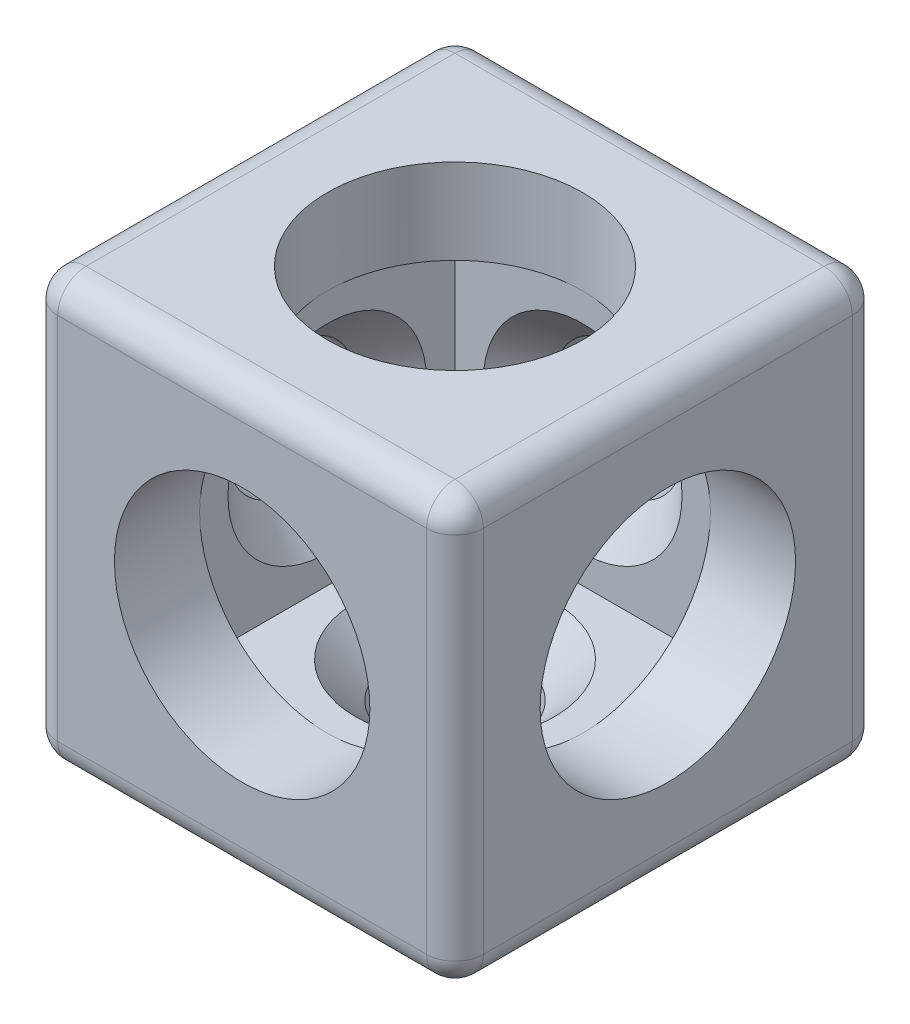
ISO-10303-21;
HEADER;
FILE_DESCRIPTION(('STEP AP214'),'2;1');
FILE_NAME('part.step','',(''),(''),'','','');
FILE_SCHEMA(('AUTOMOTIVE_DESIGN { 1 0 10303 214 1 1 1 1 }'));
ENDSEC;
DATA;
#1=APPLICATION_CONTEXT('core data for automotive mechanical design processes');
#2=APPLICATION_PROTOCOL_DEFINITION('international standard','automotive_design',2000,#1);
#3=PRODUCT_CONTEXT('',#1,'mechanical');
#4=PRODUCT('Part','Part','',(#3));
#5=PRODUCT_RELATED_PRODUCT_CATEGORY('part','',(#4));
#6=PRODUCT_DEFINITION_FORMATION('','',#4);
#7=PRODUCT_DEFINITION_CONTEXT('part definition',#1,'design');
#8=PRODUCT_DEFINITION('design','',#6,#7);
#9=PRODUCT_DEFINITION_SHAPE('','',#8);
#10=(LENGTH_UNIT() NAMED_UNIT(*) SI_UNIT(.MILLI.,.METRE.));
#11=(NAMED_UNIT(*) PLANE_ANGLE_UNIT() SI_UNIT($,.RADIAN.));
#12=(NAMED_UNIT(*) SI_UNIT($,.STERADIAN.) SOLID_ANGLE_UNIT());
#13=UNCERTAINTY_MEASURE_WITH_UNIT(LENGTH_MEASURE(1.E-05),#10,'distance_accuracy_value','');
#14=(GEOMETRIC_REPRESENTATION_CONTEXT(3) GLOBAL_UNCERTAINTY_ASSIGNED_CONTEXT((#13)) GLOBAL_UNIT_ASSIGNED_CONTEXT((#10,
#11,#12)) REPRESENTATION_CONTEXT('',''));
#15=CARTESIAN_POINT('',(0.,0.,0.));
#16=DIRECTION('',(0.,0.,1.));
#17=DIRECTION('',(1.,0.,0.));
#18=AXIS2_PLACEMENT_3D('',#15,#16,#17);
#19=CARTESIAN_POINT('',(2.00000000000001,24.,30.));
#20=DIRECTION('',(0.,-1.,0.));
#21=DIRECTION('',(0.,0.,-1.));
#22=AXIS2_PLACEMENT_3D('',#19,#20,#21);
#23=PLANE('',#22);
#24=CARTESIAN_POINT('',(15.,24.,15.));
#25=DIRECTION('',(0.,-1.,0.));
#26=DIRECTION('',(0.,0.,-1.));
#27=AXIS2_PLACEMENT_3D('',#24,#25,#26);
#28=CIRCLE('',#27,9.00000000000001);
#29=CARTESIAN_POINT('',(15.,24.,6.));
#30=VERTEX_POINT('',#29);
#31=CARTESIAN_POINT('',(24.,24.,15.));
#32=VERTEX_POINT('',#31);
#33=EDGE_CURVE('E172',#30,#32,#28,.T.);
#34=ORIENTED_EDGE('',*,*,#33,.F.);
#35=DIRECTION('',(-1.,0.,0.));
#36=VECTOR('',#35,1.);
#37=CARTESIAN_POINT('',(2.00000000000001,24.,6.));
#38=LINE('',#37,#36);
#39=CARTESIAN_POINT('',(24.,24.,6.));
#40=VERTEX_POINT('',#39);
#41=EDGE_CURVE('E213',#40,#30,#38,.T.);
#42=ORIENTED_EDGE('',*,*,#41,.F.);
#43=DIRECTION('',(0.,0.,-1.));
#44=VECTOR('',#43,1.);
#45=CARTESIAN_POINT('',(24.,24.,30.));
#46=LINE('',#45,#44);
#47=EDGE_CURVE('E208',#32,#40,#46,.T.);
#48=ORIENTED_EDGE('',*,*,#47,.F.);
#49=EDGE_LOOP('',(#34,#42,#48));
#50=FACE_BOUND('',#49,.T.);
#51=ADVANCED_FACE('F34',(#50),#23,.T.);
#52=CARTESIAN_POINT('',(15.,24.,24.));
#53=VERTEX_POINT('',#52);
#54=EDGE_CURVE('E176',#32,#53,#28,.T.);
#55=ORIENTED_EDGE('',*,*,#54,.F.);
#56=CARTESIAN_POINT('',(24.,24.,24.));
#57=VERTEX_POINT('',#56);
#58=EDGE_CURVE('E190',#57,#32,#46,.T.);
#59=ORIENTED_EDGE('',*,*,#58,.F.);
#60=DIRECTION('',(1.,0.,0.));
#61=VECTOR('',#60,1.);
#62=CARTESIAN_POINT('',(2.,24.,24.));
#63=LINE('',#62,#61);
#64=EDGE_CURVE('E191',#53,#57,#63,.T.);
#65=ORIENTED_EDGE('',*,*,#64,.F.);
#66=EDGE_LOOP('',(#55,#59,#65));
#67=FACE_BOUND('',#66,.T.);
#68=ADVANCED_FACE('F188',(#67),#23,.T.);
#69=CARTESIAN_POINT('',(6.,24.,15.));
#70=VERTEX_POINT('',#69);
#71=EDGE_CURVE('E49',#53,#70,#28,.T.);
#72=ORIENTED_EDGE('',*,*,#71,.F.);
#73=CARTESIAN_POINT('',(6.,24.,24.));
#74=VERTEX_POINT('',#73);
#75=EDGE_CURVE('E296',#74,#53,#63,.T.);
#76=ORIENTED_EDGE('',*,*,#75,.F.);
#77=DIRECTION('',(0.,0.,-1.));
#78=VECTOR('',#77,1.);
#79=CARTESIAN_POINT('',(6.,24.,30.));
#80=LINE('',#79,#78);
#81=EDGE_CURVE('E298',#74,#70,#80,.T.);
#82=ORIENTED_EDGE('',*,*,#81,.T.);
#83=EDGE_LOOP('',(#72,#76,#82));
#84=FACE_BOUND('',#83,.T.);
#85=ADVANCED_FACE('F272',(#84),#23,.T.);
#86=CARTESIAN_POINT('',(24.,2.00000000000001,30.));
#87=DIRECTION('',(-1.,0.,0.));
#88=DIRECTION('',(0.,0.,1.));
#89=AXIS2_PLACEMENT_3D('',#86,#87,#88);
#90=PLANE('',#89);
#91=CARTESIAN_POINT('',(24.,15.,15.));
#92=DIRECTION('',(-1.,0.,0.));
#93=DIRECTION('',(0.,0.,1.));
#94=AXIS2_PLACEMENT_3D('',#91,#92,#93);
#95=CIRCLE('',#94,9.);
#96=CARTESIAN_POINT('',(24.,15.,24.));
#97=VERTEX_POINT('',#96);
#98=EDGE_CURVE('E194',#97,#32,#95,.T.);
#99=ORIENTED_EDGE('',*,*,#98,.F.);
#100=DIRECTION('',(0.,-1.,0.));
#101=VECTOR('',#100,1.);
#102=CARTESIAN_POINT('',(24.,2.,24.));
#103=LINE('',#102,#101);
#104=EDGE_CURVE('E214',#57,#97,#103,.T.);
#105=ORIENTED_EDGE('',*,*,#104,.F.);
#106=ORIENTED_EDGE('',*,*,#58,.T.);
#107=EDGE_LOOP('',(#99,#105,#106));
#108=FACE_BOUND('',#107,.T.);
#109=ADVANCED_FACE('F216',(#108),#90,.T.);
#110=CARTESIAN_POINT('',(24.,15.,6.));
#111=VERTEX_POINT('',#110);
#112=EDGE_CURVE('E198',#32,#111,#95,.T.);
#113=ORIENTED_EDGE('',*,*,#112,.F.);
#114=ORIENTED_EDGE('',*,*,#47,.T.);
#115=DIRECTION('',(0.,1.,0.));
#116=VECTOR('',#115,1.);
#117=CARTESIAN_POINT('',(24.,2.00000000000001,6.));
#118=LINE('',#117,#116);
#119=EDGE_CURVE('E210',#111,#40,#118,.T.);
#120=ORIENTED_EDGE('',*,*,#119,.F.);
#121=EDGE_LOOP('',(#113,#114,#120));
#122=FACE_BOUND('',#121,.T.);
#123=ADVANCED_FACE('F207',(#122),#90,.T.);
#124=CARTESIAN_POINT('',(24.,6.,15.));
#125=VERTEX_POINT('',#124);
#126=EDGE_CURVE('E57',#111,#125,#95,.T.);
#127=ORIENTED_EDGE('',*,*,#126,.F.);
#128=CARTESIAN_POINT('',(24.,6.,6.));
#129=VERTEX_POINT('',#128);
#130=EDGE_CURVE('E225',#129,#111,#118,.T.);
#131=ORIENTED_EDGE('',*,*,#130,.F.);
#132=DIRECTION('',(0.,0.,-1.));
#133=VECTOR('',#132,1.);
#134=CARTESIAN_POINT('',(24.,6.,30.));
#135=LINE('',#134,#133);
#136=EDGE_CURVE('E230',#125,#129,#135,.T.);
#137=ORIENTED_EDGE('',*,*,#136,.F.);
#138=EDGE_LOOP('',(#127,#131,#137));
#139=FACE_BOUND('',#138,.T.);
#140=ADVANCED_FACE('F287',(#139),#90,.T.);
#141=CARTESIAN_POINT('',(2.,2.,24.));
#142=DIRECTION('',(0.,0.,1.));
#143=DIRECTION('',(1.,0.,0.));
#144=AXIS2_PLACEMENT_3D('',#141,#142,#143);
#145=PLANE('',#144);
#146=ORIENTED_EDGE('',*,*,#104,.T.);
#147=CARTESIAN_POINT('',(15.,15.,24.));
#148=DIRECTION('',(0.,0.,1.));
#149=DIRECTION('',(1.,0.,0.));
#150=AXIS2_PLACEMENT_3D('',#147,#148,#149);
#151=CIRCLE('',#150,9.);
#152=EDGE_CURVE('E239',#97,#53,#151,.T.);
#153=ORIENTED_EDGE('',*,*,#152,.T.);
#154=ORIENTED_EDGE('',*,*,#64,.T.);
#155=EDGE_LOOP('',(#146,#153,#154));
#156=FACE_BOUND('',#155,.T.);
#157=ADVANCED_FACE('F308',(#156),#145,.F.);
#158=ORIENTED_EDGE('',*,*,#75,.T.);
#159=CARTESIAN_POINT('',(6.,15.,24.));
#160=VERTEX_POINT('',#159);
#161=EDGE_CURVE('E301',#53,#160,#151,.T.);
#162=ORIENTED_EDGE('',*,*,#161,.T.);
#163=DIRECTION('',(0.,1.,0.));
#164=VECTOR('',#163,1.);
#165=CARTESIAN_POINT('',(6.,2.,24.));
#166=LINE('',#165,#164);
#167=EDGE_CURVE('E312',#160,#74,#166,.T.);
#168=ORIENTED_EDGE('',*,*,#167,.T.);
#169=EDGE_LOOP('',(#158,#162,#168));
#170=FACE_BOUND('',#169,.T.);
#171=ADVANCED_FACE('F583',(#170),#145,.F.);
#172=CARTESIAN_POINT('',(6.,6.,24.));
#173=VERTEX_POINT('',#172);
#174=EDGE_CURVE('E313',#173,#160,#166,.T.);
#175=ORIENTED_EDGE('',*,*,#174,.T.);
#176=CARTESIAN_POINT('',(15.,6.,24.));
#177=VERTEX_POINT('',#176);
#178=EDGE_CURVE('E237',#160,#177,#151,.T.);
#179=ORIENTED_EDGE('',*,*,#178,.T.);
#180=DIRECTION('',(1.,0.,0.));
#181=VECTOR('',#180,1.);
#182=CARTESIAN_POINT('',(2.00000000000001,6.,24.));
#183=LINE('',#182,#181);
#184=EDGE_CURVE('E317',#173,#177,#183,.T.);
#185=ORIENTED_EDGE('',*,*,#184,.F.);
#186=EDGE_LOOP('',(#175,#179,#185));
#187=FACE_BOUND('',#186,.T.);
#188=ADVANCED_FACE('F578',(#187),#145,.F.);
#189=CARTESIAN_POINT('',(2.00000000000001,6.,30.));
#190=DIRECTION('',(0.,1.,0.));
#191=DIRECTION('',(0.,0.,1.));
#192=AXIS2_PLACEMENT_3D('',#189,#190,#191);
#193=PLANE('',#192);
#194=CARTESIAN_POINT('',(15.,6.,15.));
#195=DIRECTION('',(0.,1.,0.));
#196=DIRECTION('',(0.,0.,1.));
#197=AXIS2_PLACEMENT_3D('',#194,#195,#196);
#198=CIRCLE('',#197,7.00000000000001);
#199=CARTESIAN_POINT('',(15.,6.,22.));
#200=VERTEX_POINT('',#199);
#201=EDGE_CURVE('E243',#200,#200,#198,.F.);
#202=ORIENTED_EDGE('',*,*,#201,.T.);
#203=EDGE_LOOP('',(#202));
#204=FACE_BOUND('',#203,.T.);
#205=CARTESIAN_POINT('',(24.,6.,24.));
#206=VERTEX_POINT('',#205);
#207=EDGE_CURVE('E227',#206,#125,#135,.T.);
#208=ORIENTED_EDGE('',*,*,#207,.T.);
#209=ORIENTED_EDGE('',*,*,#136,.T.);
#210=DIRECTION('',(-1.,0.,0.));
#211=VECTOR('',#210,1.);
#212=CARTESIAN_POINT('',(2.,6.,6.));
#213=LINE('',#212,#211);
#214=CARTESIAN_POINT('',(6.,6.,6.));
#215=VERTEX_POINT('',#214);
#216=EDGE_CURVE('E320',#129,#215,#213,.T.);
#217=ORIENTED_EDGE('',*,*,#216,.T.);
#218=DIRECTION('',(0.,0.,-1.));
#219=VECTOR('',#218,1.);
#220=CARTESIAN_POINT('',(6.,6.,30.));
#221=LINE('',#220,#219);
#222=EDGE_CURVE('E231',#173,#215,#221,.T.);
#223=ORIENTED_EDGE('',*,*,#222,.F.);
#224=ORIENTED_EDGE('',*,*,#184,.T.);
#225=EDGE_CURVE('E316',#177,#206,#183,.T.);
#226=ORIENTED_EDGE('',*,*,#225,.T.);
#227=EDGE_LOOP('',(#208,#209,#217,#223,#224,#226));
#228=FACE_BOUND('',#227,.T.);
#229=ADVANCED_FACE('F285',(#204,#228),#193,.T.);
#230=EDGE_CURVE('E199',#125,#97,#95,.T.);
#231=ORIENTED_EDGE('',*,*,#230,.F.);
#232=ORIENTED_EDGE('',*,*,#207,.F.);
#233=EDGE_CURVE('E224',#97,#206,#103,.T.);
#234=ORIENTED_EDGE('',*,*,#233,.F.);
#235=EDGE_LOOP('',(#231,#232,#234));
#236=FACE_BOUND('',#235,.T.);
#237=ADVANCED_FACE('F277',(#236),#90,.T.);
#238=EDGE_CURVE('E177',#70,#30,#28,.T.);
#239=ORIENTED_EDGE('',*,*,#238,.F.);
#240=CARTESIAN_POINT('',(6.,24.,6.));
#241=VERTEX_POINT('',#240);
#242=EDGE_CURVE('E309',#70,#241,#80,.T.);
#243=ORIENTED_EDGE('',*,*,#242,.T.);
#244=EDGE_CURVE('E218',#30,#241,#38,.T.);
#245=ORIENTED_EDGE('',*,*,#244,.F.);
#246=EDGE_LOOP('',(#239,#243,#245));
#247=FACE_BOUND('',#246,.T.);
#248=ADVANCED_FACE('F268',(#247),#23,.T.);
#249=CARTESIAN_POINT('',(6.,2.00000000000001,30.));
#250=DIRECTION('',(1.,0.,0.));
#251=DIRECTION('',(0.,0.,-1.));
#252=AXIS2_PLACEMENT_3D('',#249,#250,#251);
#253=PLANE('',#252);
#254=CARTESIAN_POINT('',(6.,15.,15.));
#255=DIRECTION('',(1.,0.,0.));
#256=DIRECTION('',(0.,0.,-1.));
#257=AXIS2_PLACEMENT_3D('',#254,#255,#256);
#258=CIRCLE('',#257,7.00000000000001);
#259=CARTESIAN_POINT('',(6.,15.,7.99999999999999));
#260=VERTEX_POINT('',#259);
#261=EDGE_CURVE('E11',#260,#260,#258,.F.);
#262=ORIENTED_EDGE('',*,*,#261,.T.);
#263=EDGE_LOOP('',(#262));
#264=FACE_BOUND('',#263,.T.);
#265=ORIENTED_EDGE('',*,*,#242,.F.);
#266=ORIENTED_EDGE('',*,*,#81,.F.);
#267=ORIENTED_EDGE('',*,*,#167,.F.);
#268=ORIENTED_EDGE('',*,*,#174,.F.);
#269=ORIENTED_EDGE('',*,*,#222,.T.);
#270=DIRECTION('',(0.,1.,0.));
#271=VECTOR('',#270,1.);
#272=CARTESIAN_POINT('',(6.,2.,6.));
#273=LINE('',#272,#271);
#274=EDGE_CURVE('E238',#215,#241,#273,.T.);
#275=ORIENTED_EDGE('',*,*,#274,.T.);
#276=EDGE_LOOP('',(#265,#266,#267,#268,#269,#275));
#277=FACE_BOUND('',#276,.T.);
#278=ADVANCED_FACE('F276',(#264,#277),#253,.T.);
#279=ORIENTED_EDGE('',*,*,#225,.F.);
#280=EDGE_CURVE('E234',#177,#97,#151,.T.);
#281=ORIENTED_EDGE('',*,*,#280,.T.);
#282=ORIENTED_EDGE('',*,*,#233,.T.);
#283=EDGE_LOOP('',(#279,#281,#282));
#284=FACE_BOUND('',#283,.T.);
#285=ADVANCED_FACE('F283',(#284),#145,.F.);
#286=CARTESIAN_POINT('',(2.,2.,6.));
#287=DIRECTION('',(0.,0.,1.));
#288=DIRECTION('',(1.,0.,0.));
#289=AXIS2_PLACEMENT_3D('',#286,#287,#288);
#290=PLANE('',#289);
#291=CARTESIAN_POINT('',(15.,15.,6.));
#292=DIRECTION('',(0.,0.,1.));
#293=DIRECTION('',(1.,0.,0.));
#294=AXIS2_PLACEMENT_3D('',#291,#292,#293);
#295=CIRCLE('',#294,7.00000000000001);
#296=CARTESIAN_POINT('',(22.,15.,6.));
#297=VERTEX_POINT('',#296);
#298=EDGE_CURVE('E249',#297,#297,#295,.F.);
#299=ORIENTED_EDGE('',*,*,#298,.T.);
#300=EDGE_LOOP('',(#299));
#301=FACE_BOUND('',#300,.T.);
#302=ORIENTED_EDGE('',*,*,#41,.T.);
#303=ORIENTED_EDGE('',*,*,#244,.T.);
#304=ORIENTED_EDGE('',*,*,#274,.F.);
#305=ORIENTED_EDGE('',*,*,#216,.F.);
#306=ORIENTED_EDGE('',*,*,#130,.T.);
#307=ORIENTED_EDGE('',*,*,#119,.T.);
#308=EDGE_LOOP('',(#302,#303,#304,#305,#306,#307));
#309=FACE_BOUND('',#308,.T.);
#310=ADVANCED_FACE('F598',(#301,#309),#290,.T.);
#311=CARTESIAN_POINT('',(15.,15.,20.));
#312=DIRECTION('',(0.,0.,1.));
#313=DIRECTION('',(1.,0.,0.));
#314=AXIS2_PLACEMENT_3D('',#311,#312,#313);
#315=CYLINDRICAL_SURFACE('',#314,9.);
#316=CARTESIAN_POINT('',(15.,15.,30.));
#317=DIRECTION('',(0.,0.,1.));
#318=DIRECTION('',(1.,0.,0.));
#319=AXIS2_PLACEMENT_3D('',#316,#317,#318);
#320=CIRCLE('',#319,9.);
#321=CARTESIAN_POINT('',(24.,15.,30.));
#322=VERTEX_POINT('',#321);
#323=EDGE_CURVE('E203',#322,#322,#320,.T.);
#324=ORIENTED_EDGE('',*,*,#323,.T.);
#325=EDGE_LOOP('',(#324));
#326=FACE_BOUND('',#325,.T.);
#327=ORIENTED_EDGE('',*,*,#280,.F.);
#328=ORIENTED_EDGE('',*,*,#178,.F.);
#329=ORIENTED_EDGE('',*,*,#161,.F.);
#330=ORIENTED_EDGE('',*,*,#152,.F.);
#331=EDGE_LOOP('',(#327,#328,#329,#330));
#332=FACE_BOUND('',#331,.T.);
#333=ADVANCED_FACE('F303',(#326,#332),#315,.F.);
#334=CARTESIAN_POINT('',(2.,2.,30.));
#335=DIRECTION('',(0.,0.,-1.));
#336=DIRECTION('',(-1.,0.,0.));
#337=AXIS2_PLACEMENT_3D('',#334,#335,#336);
#338=CYLINDRICAL_SURFACE('',#337,2.);
#339=DIRECTION('',(0.,0.,-1.));
#340=VECTOR('',#339,1.);
#341=CARTESIAN_POINT('',(0.,2.00000000000001,30.));
#342=LINE('',#341,#340);
#343=CARTESIAN_POINT('',(0.,2.00000000000001,28.));
#344=VERTEX_POINT('',#343);
#345=CARTESIAN_POINT('',(0.,2.00000000000001,2.));
#346=VERTEX_POINT('',#345);
#347=EDGE_CURVE('E351',#344,#346,#342,.T.);
#348=ORIENTED_EDGE('',*,*,#347,.T.);
#349=CARTESIAN_POINT('',(2.,2.,2.));
#350=DIRECTION('',(0.,0.,-1.));
#351=DIRECTION('',(-1.,0.,0.));
#352=AXIS2_PLACEMENT_3D('',#349,#350,#351);
#353=CIRCLE('',#352,2.);
#354=CARTESIAN_POINT('',(2.00000000000001,0.,2.));
#355=VERTEX_POINT('',#354);
#356=EDGE_CURVE('E378',#346,#355,#353,.F.);
#357=ORIENTED_EDGE('',*,*,#356,.T.);
#358=DIRECTION('',(0.,0.,-1.));
#359=VECTOR('',#358,1.);
#360=CARTESIAN_POINT('',(2.00000000000001,0.,30.));
#361=LINE('',#360,#359);
#362=CARTESIAN_POINT('',(2.00000000000001,0.,28.));
#363=VERTEX_POINT('',#362);
#364=EDGE_CURVE('E421',#363,#355,#361,.T.);
#365=ORIENTED_EDGE('',*,*,#364,.F.);
#366=CARTESIAN_POINT('',(2.,2.,28.));
#367=DIRECTION('',(0.,0.,-1.));
#368=DIRECTION('',(-1.,0.,0.));
#369=AXIS2_PLACEMENT_3D('',#366,#367,#368);
#370=CIRCLE('',#369,2.);
#371=EDGE_CURVE('E380',#363,#344,#370,.T.);
#372=ORIENTED_EDGE('',*,*,#371,.T.);
#373=EDGE_LOOP('',(#348,#357,#365,#372));
#374=FACE_BOUND('',#373,.T.);
#375=ADVANCED_FACE('F467',(#374),#338,.T.);
#376=CARTESIAN_POINT('',(2.00000000000001,0.,30.));
#377=DIRECTION('',(0.,1.,0.));
#378=DIRECTION('',(0.,0.,1.));
#379=AXIS2_PLACEMENT_3D('',#376,#377,#378);
#380=PLANE('',#379);
#381=CARTESIAN_POINT('',(15.,0.,15.));
#382=DIRECTION('',(0.,-1.,0.));
#383=DIRECTION('',(0.,0.,-1.));
#384=AXIS2_PLACEMENT_3D('',#381,#382,#383);
#385=CIRCLE('',#384,4.5);
#386=CARTESIAN_POINT('',(15.,0.,10.5));
#387=VERTEX_POINT('',#386);
#388=EDGE_CURVE('E457',#387,#387,#385,.T.);
#389=ORIENTED_EDGE('',*,*,#388,.F.);
#390=EDGE_LOOP('',(#389));
#391=FACE_BOUND('',#390,.T.);
#392=ORIENTED_EDGE('',*,*,#364,.T.);
#393=DIRECTION('',(1.,0.,0.));
#394=VECTOR('',#393,1.);
#395=CARTESIAN_POINT('',(2.00000000000001,0.,2.));
#396=LINE('',#395,#394);
#397=CARTESIAN_POINT('',(28.,0.,2.));
#398=VERTEX_POINT('',#397);
#399=EDGE_CURVE('E416',#355,#398,#396,.T.);
#400=ORIENTED_EDGE('',*,*,#399,.T.);
#401=DIRECTION('',(0.,0.,-1.));
#402=VECTOR('',#401,1.);
#403=CARTESIAN_POINT('',(28.,0.,30.));
#404=LINE('',#403,#402);
#405=CARTESIAN_POINT('',(28.,0.,28.));
#406=VERTEX_POINT('',#405);
#407=EDGE_CURVE('E424',#406,#398,#404,.T.);
#408=ORIENTED_EDGE('',*,*,#407,.F.);
#409=DIRECTION('',(1.,0.,0.));
#410=VECTOR('',#409,1.);
#411=CARTESIAN_POINT('',(2.00000000000001,0.,28.));
#412=LINE('',#411,#410);
#413=EDGE_CURVE('E419',#406,#363,#412,.F.);
#414=ORIENTED_EDGE('',*,*,#413,.T.);
#415=EDGE_LOOP('',(#392,#400,#408,#414));
#416=FACE_BOUND('',#415,.T.);
#417=ADVANCED_FACE('F463',(#391,#416),#380,.F.);
#418=CARTESIAN_POINT('',(28.,2.,30.));
#419=DIRECTION('',(0.,0.,-1.));
#420=DIRECTION('',(-1.,0.,0.));
#421=AXIS2_PLACEMENT_3D('',#418,#419,#420);
#422=CYLINDRICAL_SURFACE('',#421,2.);
#423=ORIENTED_EDGE('',*,*,#407,.T.);
#424=CARTESIAN_POINT('',(28.,2.,2.));
#425=DIRECTION('',(0.,0.,-1.));
#426=DIRECTION('',(-1.,0.,0.));
#427=AXIS2_PLACEMENT_3D('',#424,#425,#426);
#428=CIRCLE('',#427,2.);
#429=CARTESIAN_POINT('',(30.,2.00000000000001,2.));
#430=VERTEX_POINT('',#429);
#431=EDGE_CURVE('E403',#398,#430,#428,.F.);
#432=ORIENTED_EDGE('',*,*,#431,.T.);
#433=DIRECTION('',(0.,0.,-1.));
#434=VECTOR('',#433,1.);
#435=CARTESIAN_POINT('',(30.,2.00000000000001,30.));
#436=LINE('',#435,#434);
#437=CARTESIAN_POINT('',(30.,2.00000000000001,28.));
#438=VERTEX_POINT('',#437);
#439=EDGE_CURVE('E427',#438,#430,#436,.T.);
#440=ORIENTED_EDGE('',*,*,#439,.F.);
#441=CARTESIAN_POINT('',(28.,2.,28.));
#442=DIRECTION('',(0.,0.,-1.));
#443=DIRECTION('',(-1.,0.,0.));
#444=AXIS2_PLACEMENT_3D('',#441,#442,#443);
#445=CIRCLE('',#444,2.);
#446=EDGE_CURVE('E405',#438,#406,#445,.T.);
#447=ORIENTED_EDGE('',*,*,#446,.T.);
#448=EDGE_LOOP('',(#423,#432,#440,#447));
#449=FACE_BOUND('',#448,.T.);
#450=ADVANCED_FACE('F466',(#449),#422,.T.);
#451=CARTESIAN_POINT('',(30.,2.00000000000001,30.));
#452=DIRECTION('',(-1.,0.,0.));
#453=DIRECTION('',(0.,0.,1.));
#454=AXIS2_PLACEMENT_3D('',#451,#452,#453);
#455=PLANE('',#454);
#456=CARTESIAN_POINT('',(30.,15.,15.));
#457=DIRECTION('',(1.,0.,0.));
#458=DIRECTION('',(0.,0.,-1.));
#459=AXIS2_PLACEMENT_3D('',#456,#457,#458);
#460=CIRCLE('',#459,9.);
#461=CARTESIAN_POINT('',(30.,15.,6.));
#462=VERTEX_POINT('',#461);
#463=EDGE_CURVE('E182',#462,#462,#460,.T.);
#464=ORIENTED_EDGE('',*,*,#463,.F.);
#465=EDGE_LOOP('',(#464));
#466=FACE_BOUND('',#465,.T.);
#467=ORIENTED_EDGE('',*,*,#439,.T.);
#468=DIRECTION('',(0.,1.,0.));
#469=VECTOR('',#468,1.);
#470=CARTESIAN_POINT('',(30.,2.00000000000001,2.));
#471=LINE('',#470,#469);
#472=CARTESIAN_POINT('',(30.,28.,2.));
#473=VERTEX_POINT('',#472);
#474=EDGE_CURVE('E399',#430,#473,#471,.T.);
#475=ORIENTED_EDGE('',*,*,#474,.T.);
#476=DIRECTION('',(0.,0.,-1.));
#477=VECTOR('',#476,1.);
#478=CARTESIAN_POINT('',(30.,28.,30.));
#479=LINE('',#478,#477);
#480=CARTESIAN_POINT('',(30.,28.,28.));
#481=VERTEX_POINT('',#480);
#482=EDGE_CURVE('E430',#481,#473,#479,.T.);
#483=ORIENTED_EDGE('',*,*,#482,.F.);
#484=DIRECTION('',(0.,1.,0.));
#485=VECTOR('',#484,1.);
#486=CARTESIAN_POINT('',(30.,2.00000000000001,28.));
#487=LINE('',#486,#485);
#488=EDGE_CURVE('E401',#481,#438,#487,.F.);
#489=ORIENTED_EDGE('',*,*,#488,.T.);
#490=EDGE_LOOP('',(#467,#475,#483,#489));
#491=FACE_BOUND('',#490,.T.);
#492=ADVANCED_FACE('F494',(#466,#491),#455,.F.);
#493=CARTESIAN_POINT('',(28.,28.,30.));
#494=DIRECTION('',(0.,0.,-1.));
#495=DIRECTION('',(-1.,0.,0.));
#496=AXIS2_PLACEMENT_3D('',#493,#494,#495);
#497=CYLINDRICAL_SURFACE('',#496,2.);
#498=ORIENTED_EDGE('',*,*,#482,.T.);
#499=CARTESIAN_POINT('',(28.,28.,2.));
#500=DIRECTION('',(0.,0.,-1.));
#501=DIRECTION('',(-1.,0.,0.));
#502=AXIS2_PLACEMENT_3D('',#499,#500,#501);
#503=CIRCLE('',#502,2.);
#504=CARTESIAN_POINT('',(28.,30.,2.));
#505=VERTEX_POINT('',#504);
#506=EDGE_CURVE('E395',#473,#505,#503,.F.);
#507=ORIENTED_EDGE('',*,*,#506,.T.);
#508=DIRECTION('',(0.,0.,-1.));
#509=VECTOR('',#508,1.);
#510=CARTESIAN_POINT('',(28.,30.,30.));
#511=LINE('',#510,#509);
#512=CARTESIAN_POINT('',(28.,30.,28.));
#513=VERTEX_POINT('',#512);
#514=EDGE_CURVE('E433',#513,#505,#511,.T.);
#515=ORIENTED_EDGE('',*,*,#514,.F.);
#516=CARTESIAN_POINT('',(28.,28.,28.));
#517=DIRECTION('',(0.,0.,-1.));
#518=DIRECTION('',(-1.,0.,0.));
#519=AXIS2_PLACEMENT_3D('',#516,#517,#518);
#520=CIRCLE('',#519,2.);
#521=EDGE_CURVE('E397',#513,#481,#520,.T.);
#522=ORIENTED_EDGE('',*,*,#521,.T.);
#523=EDGE_LOOP('',(#498,#507,#515,#522));
#524=FACE_BOUND('',#523,.T.);
#525=ADVANCED_FACE('F507',(#524),#497,.T.);
#526=CARTESIAN_POINT('',(2.00000000000001,30.,30.));
#527=DIRECTION('',(0.,-1.,0.));
#528=DIRECTION('',(0.,0.,-1.));
#529=AXIS2_PLACEMENT_3D('',#526,#527,#528);
#530=PLANE('',#529);
#531=CARTESIAN_POINT('',(15.,30.,15.));
#532=DIRECTION('',(0.,1.,0.));
#533=DIRECTION('',(0.,0.,1.));
#534=AXIS2_PLACEMENT_3D('',#531,#532,#533);
#535=CIRCLE('',#534,9.00000000000001);
#536=CARTESIAN_POINT('',(15.,30.,24.));
#537=VERTEX_POINT('',#536);
#538=EDGE_CURVE('E448',#537,#537,#535,.T.);
#539=ORIENTED_EDGE('',*,*,#538,.F.);
#540=EDGE_LOOP('',(#539));
#541=FACE_BOUND('',#540,.T.);
#542=ORIENTED_EDGE('',*,*,#514,.T.);
#543=DIRECTION('',(-1.,0.,0.));
#544=VECTOR('',#543,1.);
#545=CARTESIAN_POINT('',(2.00000000000001,30.,2.));
#546=LINE('',#545,#544);
#547=CARTESIAN_POINT('',(2.00000000000001,30.,2.));
#548=VERTEX_POINT('',#547);
#549=EDGE_CURVE('E391',#505,#548,#546,.T.);
#550=ORIENTED_EDGE('',*,*,#549,.T.);
#551=DIRECTION('',(0.,0.,-1.));
#552=VECTOR('',#551,1.);
#553=CARTESIAN_POINT('',(2.00000000000001,30.,30.));
#554=LINE('',#553,#552);
#555=CARTESIAN_POINT('',(2.00000000000001,30.,28.));
#556=VERTEX_POINT('',#555);
#557=EDGE_CURVE('E436',#556,#548,#554,.T.);
#558=ORIENTED_EDGE('',*,*,#557,.F.);
#559=DIRECTION('',(-1.,0.,0.));
#560=VECTOR('',#559,1.);
#561=CARTESIAN_POINT('',(28.,30.,28.));
#562=LINE('',#561,#560);
#563=EDGE_CURVE('E393',#556,#513,#562,.F.);
#564=ORIENTED_EDGE('',*,*,#563,.T.);
#565=EDGE_LOOP('',(#542,#550,#558,#564));
#566=FACE_BOUND('',#565,.T.);
#567=ADVANCED_FACE('F511',(#541,#566),#530,.F.);
#568=CARTESIAN_POINT('',(2.,28.,30.));
#569=DIRECTION('',(0.,0.,-1.));
#570=DIRECTION('',(-1.,0.,0.));
#571=AXIS2_PLACEMENT_3D('',#568,#569,#570);
#572=CYLINDRICAL_SURFACE('',#571,2.);
#573=ORIENTED_EDGE('',*,*,#557,.T.);
#574=CARTESIAN_POINT('',(2.,28.,2.));
#575=DIRECTION('',(0.,0.,-1.));
#576=DIRECTION('',(-1.,0.,0.));
#577=AXIS2_PLACEMENT_3D('',#574,#575,#576);
#578=CIRCLE('',#577,2.);
#579=CARTESIAN_POINT('',(0.,28.,2.));
#580=VERTEX_POINT('',#579);
#581=EDGE_CURVE('E387',#548,#580,#578,.F.);
#582=ORIENTED_EDGE('',*,*,#581,.T.);
#583=DIRECTION('',(0.,0.,-1.));
#584=VECTOR('',#583,1.);
#585=CARTESIAN_POINT('',(0.,28.,30.));
#586=LINE('',#585,#584);
#587=CARTESIAN_POINT('',(0.,28.,28.));
#588=VERTEX_POINT('',#587);
#589=EDGE_CURVE('E439',#588,#580,#586,.T.);
#590=ORIENTED_EDGE('',*,*,#589,.F.);
#591=CARTESIAN_POINT('',(2.,28.,28.));
#592=DIRECTION('',(0.,0.,-1.));
#593=DIRECTION('',(-1.,0.,0.));
#594=AXIS2_PLACEMENT_3D('',#591,#592,#593);
#595=CIRCLE('',#594,2.);
#596=EDGE_CURVE('E389',#588,#556,#595,.T.);
#597=ORIENTED_EDGE('',*,*,#596,.T.);
#598=EDGE_LOOP('',(#573,#582,#590,#597));
#599=FACE_BOUND('',#598,.T.);
#600=ADVANCED_FACE('F525',(#599),#572,.T.);
#601=CARTESIAN_POINT('',(0.,2.00000000000001,30.));
#602=DIRECTION('',(1.,0.,0.));
#603=DIRECTION('',(0.,0.,-1.));
#604=AXIS2_PLACEMENT_3D('',#601,#602,#603);
#605=PLANE('',#604);
#606=CARTESIAN_POINT('',(0.,15.,15.));
#607=DIRECTION('',(-1.,0.,0.));
#608=DIRECTION('',(0.,0.,1.));
#609=AXIS2_PLACEMENT_3D('',#606,#607,#608);
#610=CIRCLE('',#609,4.5);
#611=CARTESIAN_POINT('',(0.,15.,19.5));
#612=VERTEX_POINT('',#611);
#613=EDGE_CURVE('E451',#612,#612,#610,.T.);
#614=ORIENTED_EDGE('',*,*,#613,.F.);
#615=EDGE_LOOP('',(#614));
#616=FACE_BOUND('',#615,.T.);
#617=ORIENTED_EDGE('',*,*,#589,.T.);
#618=DIRECTION('',(0.,-1.,0.));
#619=VECTOR('',#618,1.);
#620=CARTESIAN_POINT('',(0.,2.00000000000001,2.));
#621=LINE('',#620,#619);
#622=EDGE_CURVE('E382',#580,#346,#621,.T.);
#623=ORIENTED_EDGE('',*,*,#622,.T.);
#624=ORIENTED_EDGE('',*,*,#347,.F.);
#625=DIRECTION('',(0.,-1.,0.));
#626=VECTOR('',#625,1.);
#627=CARTESIAN_POINT('',(0.,28.,28.));
#628=LINE('',#627,#626);
#629=EDGE_CURVE('E384',#344,#588,#628,.F.);
#630=ORIENTED_EDGE('',*,*,#629,.T.);
#631=EDGE_LOOP('',(#617,#623,#624,#630));
#632=FACE_BOUND('',#631,.T.);
#633=ADVANCED_FACE('F527',(#616,#632),#605,.F.);
#634=CARTESIAN_POINT('',(2.,2.,30.));
#635=DIRECTION('',(0.,0.,1.));
#636=DIRECTION('',(1.,0.,0.));
#637=AXIS2_PLACEMENT_3D('',#634,#635,#636);
#638=PLANE('',#637);
#639=ORIENTED_EDGE('',*,*,#323,.F.);
#640=EDGE_LOOP('',(#639));
#641=FACE_BOUND('',#640,.T.);
#642=DIRECTION('',(-1.,0.,0.));
#643=VECTOR('',#642,1.);
#644=CARTESIAN_POINT('',(2.00000000000001,28.,30.));
#645=LINE('',#644,#643);
#646=CARTESIAN_POINT('',(28.,28.,30.));
#647=VERTEX_POINT('',#646);
#648=CARTESIAN_POINT('',(2.,28.,30.));
#649=VERTEX_POINT('',#648);
#650=EDGE_CURVE('E372',#647,#649,#645,.T.);
#651=ORIENTED_EDGE('',*,*,#650,.T.);
#652=DIRECTION('',(0.,-1.,0.));
#653=VECTOR('',#652,1.);
#654=CARTESIAN_POINT('',(2.,2.00000000000001,30.));
#655=LINE('',#654,#653);
#656=CARTESIAN_POINT('',(2.00000000000001,2.,30.));
#657=VERTEX_POINT('',#656);
#658=EDGE_CURVE('E233',#649,#657,#655,.T.);
#659=ORIENTED_EDGE('',*,*,#658,.T.);
#660=DIRECTION('',(1.,0.,0.));
#661=VECTOR('',#660,1.);
#662=CARTESIAN_POINT('',(28.,2.,30.));
#663=LINE('',#662,#661);
#664=CARTESIAN_POINT('',(28.,2.,30.));
#665=VERTEX_POINT('',#664);
#666=EDGE_CURVE('E376',#657,#665,#663,.T.);
#667=ORIENTED_EDGE('',*,*,#666,.T.);
#668=DIRECTION('',(0.,1.,0.));
#669=VECTOR('',#668,1.);
#670=CARTESIAN_POINT('',(28.,28.,30.));
#671=LINE('',#670,#669);
#672=EDGE_CURVE('E374',#665,#647,#671,.T.);
#673=ORIENTED_EDGE('',*,*,#672,.T.);
#674=EDGE_LOOP('',(#651,#659,#667,#673));
#675=FACE_BOUND('',#674,.T.);
#676=ADVANCED_FACE('F545',(#641,#675),#638,.T.);
#677=CARTESIAN_POINT('',(2.,2.,0.));
#678=DIRECTION('',(0.,0.,1.));
#679=DIRECTION('',(1.,0.,0.));
#680=AXIS2_PLACEMENT_3D('',#677,#678,#679);
#681=PLANE('',#680);
#682=CARTESIAN_POINT('',(15.,15.,0.));
#683=DIRECTION('',(0.,0.,-1.));
#684=DIRECTION('',(-1.,0.,0.));
#685=AXIS2_PLACEMENT_3D('',#682,#683,#684);
#686=CIRCLE('',#685,4.5);
#687=CARTESIAN_POINT('',(10.5,15.,0.));
#688=VERTEX_POINT('',#687);
#689=EDGE_CURVE('E454',#688,#688,#686,.T.);
#690=ORIENTED_EDGE('',*,*,#689,.F.);
#691=EDGE_LOOP('',(#690));
#692=FACE_BOUND('',#691,.T.);
#693=DIRECTION('',(0.,1.,0.));
#694=VECTOR('',#693,1.);
#695=CARTESIAN_POINT('',(28.,2.,0.));
#696=LINE('',#695,#694);
#697=CARTESIAN_POINT('',(28.,28.,0.));
#698=VERTEX_POINT('',#697);
#699=CARTESIAN_POINT('',(28.,2.,0.));
#700=VERTEX_POINT('',#699);
#701=EDGE_CURVE('E410',#698,#700,#696,.F.);
#702=ORIENTED_EDGE('',*,*,#701,.T.);
#703=DIRECTION('',(1.,0.,0.));
#704=VECTOR('',#703,1.);
#705=CARTESIAN_POINT('',(2.,2.,0.));
#706=LINE('',#705,#704);
#707=CARTESIAN_POINT('',(2.,2.00000000000001,0.));
#708=VERTEX_POINT('',#707);
#709=EDGE_CURVE('E407',#700,#708,#706,.F.);
#710=ORIENTED_EDGE('',*,*,#709,.T.);
#711=DIRECTION('',(0.,-1.,0.));
#712=VECTOR('',#711,1.);
#713=CARTESIAN_POINT('',(2.,2.,0.));
#714=LINE('',#713,#712);
#715=CARTESIAN_POINT('',(2.,28.,0.));
#716=VERTEX_POINT('',#715);
#717=EDGE_CURVE('E414',#708,#716,#714,.F.);
#718=ORIENTED_EDGE('',*,*,#717,.T.);
#719=DIRECTION('',(-1.,0.,0.));
#720=VECTOR('',#719,1.);
#721=CARTESIAN_POINT('',(2.,28.,0.));
#722=LINE('',#721,#720);
#723=EDGE_CURVE('E412',#716,#698,#722,.F.);
#724=ORIENTED_EDGE('',*,*,#723,.T.);
#725=EDGE_LOOP('',(#702,#710,#718,#724));
#726=FACE_BOUND('',#725,.T.);
#727=ADVANCED_FACE('F680',(#692,#726),#681,.F.);
#728=CARTESIAN_POINT('',(2.00000000000001,28.,2.));
#729=DIRECTION('',(-1.,0.,0.));
#730=DIRECTION('',(0.,0.,1.));
#731=AXIS2_PLACEMENT_3D('',#728,#729,#730);
#732=CYLINDRICAL_SURFACE('',#731,2.);
#733=CARTESIAN_POINT('',(2.00000000000001,28.,2.));
#734=DIRECTION('',(-1.,0.,0.));
#735=DIRECTION('',(0.,0.,1.));
#736=AXIS2_PLACEMENT_3D('',#733,#734,#735);
#737=CIRCLE('',#736,2.);
#738=EDGE_CURVE('E348',#548,#716,#737,.T.);
#739=ORIENTED_EDGE('',*,*,#738,.F.);
#740=ORIENTED_EDGE('',*,*,#549,.F.);
#741=CARTESIAN_POINT('',(28.,28.,2.));
#742=DIRECTION('',(1.,0.,0.));
#743=DIRECTION('',(0.,1.,0.));
#744=AXIS2_PLACEMENT_3D('',#741,#742,#743);
#745=CIRCLE('',#744,2.);
#746=EDGE_CURVE('E352',#698,#505,#745,.T.);
#747=ORIENTED_EDGE('',*,*,#746,.F.);
#748=ORIENTED_EDGE('',*,*,#723,.F.);
#749=EDGE_LOOP('',(#739,#740,#747,#748));
#750=FACE_BOUND('',#749,.T.);
#751=ADVANCED_FACE('F516',(#750),#732,.T.);
#752=CARTESIAN_POINT('',(2.,28.,2.));
#753=DIRECTION('',(0.,0.,1.));
#754=DIRECTION('',(1.,0.,0.));
#755=AXIS2_PLACEMENT_3D('',#752,#753,#754);
#756=SPHERICAL_SURFACE('',#755,2.);
#757=ORIENTED_EDGE('',*,*,#581,.F.);
#758=ORIENTED_EDGE('',*,*,#738,.T.);
#759=CARTESIAN_POINT('',(2.,28.,2.));
#760=DIRECTION('',(0.,-1.,0.));
#761=DIRECTION('',(1.,0.,0.));
#762=AXIS2_PLACEMENT_3D('',#759,#760,#761);
#763=CIRCLE('',#762,2.);
#764=EDGE_CURVE('E355',#580,#716,#763,.T.);
#765=ORIENTED_EDGE('',*,*,#764,.F.);
#766=EDGE_LOOP('',(#757,#758,#765));
#767=FACE_BOUND('',#766,.T.);
#768=ADVANCED_FACE('F521',(#767),#756,.T.);
#769=CARTESIAN_POINT('',(28.,28.,2.));
#770=DIRECTION('',(0.,0.,1.));
#771=DIRECTION('',(1.,0.,0.));
#772=AXIS2_PLACEMENT_3D('',#769,#770,#771);
#773=SPHERICAL_SURFACE('',#772,2.);
#774=ORIENTED_EDGE('',*,*,#746,.T.);
#775=ORIENTED_EDGE('',*,*,#506,.F.);
#776=CARTESIAN_POINT('',(28.,28.,2.));
#777=DIRECTION('',(0.,-1.,0.));
#778=DIRECTION('',(1.,0.,0.));
#779=AXIS2_PLACEMENT_3D('',#776,#777,#778);
#780=CIRCLE('',#779,2.);
#781=EDGE_CURVE('E358',#698,#473,#780,.T.);
#782=ORIENTED_EDGE('',*,*,#781,.F.);
#783=EDGE_LOOP('',(#774,#775,#782));
#784=FACE_BOUND('',#783,.T.);
#785=ADVANCED_FACE('F503',(#784),#773,.T.);
#786=CARTESIAN_POINT('',(2.,2.00000000000001,2.));
#787=DIRECTION('',(0.,-1.,0.));
#788=DIRECTION('',(0.,0.,-1.));
#789=AXIS2_PLACEMENT_3D('',#786,#787,#788);
#790=CYLINDRICAL_SURFACE('',#789,2.);
#791=ORIENTED_EDGE('',*,*,#764,.T.);
#792=ORIENTED_EDGE('',*,*,#717,.F.);
#793=CARTESIAN_POINT('',(2.,2.00000000000001,2.));
#794=DIRECTION('',(0.,-1.,0.));
#795=DIRECTION('',(0.,0.,-1.));
#796=AXIS2_PLACEMENT_3D('',#793,#794,#795);
#797=CIRCLE('',#796,2.);
#798=EDGE_CURVE('E361',#346,#708,#797,.T.);
#799=ORIENTED_EDGE('',*,*,#798,.F.);
#800=ORIENTED_EDGE('',*,*,#622,.F.);
#801=EDGE_LOOP('',(#791,#792,#799,#800));
#802=FACE_BOUND('',#801,.T.);
#803=ADVANCED_FACE('F773',(#802),#790,.T.);
#804=CARTESIAN_POINT('',(28.,2.00000000000001,2.));
#805=DIRECTION('',(0.,1.,0.));
#806=DIRECTION('',(0.,0.,1.));
#807=AXIS2_PLACEMENT_3D('',#804,#805,#806);
#808=CYLINDRICAL_SURFACE('',#807,2.);
#809=ORIENTED_EDGE('',*,*,#781,.T.);
#810=ORIENTED_EDGE('',*,*,#474,.F.);
#811=CARTESIAN_POINT('',(28.,2.,2.));
#812=DIRECTION('',(0.,-1.,0.));
#813=DIRECTION('',(1.,0.,0.));
#814=AXIS2_PLACEMENT_3D('',#811,#812,#813);
#815=CIRCLE('',#814,2.);
#816=EDGE_CURVE('E364',#700,#430,#815,.T.);
#817=ORIENTED_EDGE('',*,*,#816,.F.);
#818=ORIENTED_EDGE('',*,*,#701,.F.);
#819=EDGE_LOOP('',(#809,#810,#817,#818));
#820=FACE_BOUND('',#819,.T.);
#821=ADVANCED_FACE('F498',(#820),#808,.T.);
#822=CARTESIAN_POINT('',(2.,2.,2.));
#823=DIRECTION('',(0.,0.,1.));
#824=DIRECTION('',(1.,0.,0.));
#825=AXIS2_PLACEMENT_3D('',#822,#823,#824);
#826=SPHERICAL_SURFACE('',#825,2.);
#827=ORIENTED_EDGE('',*,*,#356,.F.);
#828=ORIENTED_EDGE('',*,*,#798,.T.);
#829=CARTESIAN_POINT('',(2.,2.,2.));
#830=DIRECTION('',(1.,0.,0.));
#831=DIRECTION('',(0.,1.,0.));
#832=AXIS2_PLACEMENT_3D('',#829,#830,#831);
#833=CIRCLE('',#832,2.);
#834=EDGE_CURVE('E367',#355,#708,#833,.T.);
#835=ORIENTED_EDGE('',*,*,#834,.F.);
#836=EDGE_LOOP('',(#827,#828,#835));
#837=FACE_BOUND('',#836,.T.);
#838=ADVANCED_FACE('F478',(#837),#826,.T.);
#839=CARTESIAN_POINT('',(28.,2.,2.));
#840=DIRECTION('',(0.,0.,1.));
#841=DIRECTION('',(1.,0.,0.));
#842=AXIS2_PLACEMENT_3D('',#839,#840,#841);
#843=SPHERICAL_SURFACE('',#842,2.);
#844=ORIENTED_EDGE('',*,*,#816,.T.);
#845=ORIENTED_EDGE('',*,*,#431,.F.);
#846=CARTESIAN_POINT('',(28.,2.,2.));
#847=DIRECTION('',(-1.,0.,0.));
#848=DIRECTION('',(0.,-1.,0.));
#849=AXIS2_PLACEMENT_3D('',#846,#847,#848);
#850=CIRCLE('',#849,2.);
#851=EDGE_CURVE('E328',#700,#398,#850,.T.);
#852=ORIENTED_EDGE('',*,*,#851,.F.);
#853=EDGE_LOOP('',(#844,#845,#852));
#854=FACE_BOUND('',#853,.T.);
#855=ADVANCED_FACE('F487',(#854),#843,.T.);
#856=CARTESIAN_POINT('',(2.00000000000001,2.,2.));
#857=DIRECTION('',(1.,0.,0.));
#858=DIRECTION('',(0.,0.,-1.));
#859=AXIS2_PLACEMENT_3D('',#856,#857,#858);
#860=CYLINDRICAL_SURFACE('',#859,2.);
#861=ORIENTED_EDGE('',*,*,#834,.T.);
#862=ORIENTED_EDGE('',*,*,#709,.F.);
#863=ORIENTED_EDGE('',*,*,#851,.T.);
#864=ORIENTED_EDGE('',*,*,#399,.F.);
#865=EDGE_LOOP('',(#861,#862,#863,#864));
#866=FACE_BOUND('',#865,.T.);
#867=ADVANCED_FACE('F483',(#866),#860,.T.);
#868=CARTESIAN_POINT('',(28.,2.,28.));
#869=DIRECTION('',(0.,-1.,0.));
#870=DIRECTION('',(0.,0.,-1.));
#871=AXIS2_PLACEMENT_3D('',#868,#869,#870);
#872=CYLINDRICAL_SURFACE('',#871,2.);
#873=CARTESIAN_POINT('',(28.,2.00000000000001,28.));
#874=DIRECTION('',(0.,-1.,0.));
#875=DIRECTION('',(0.,0.,-1.));
#876=AXIS2_PLACEMENT_3D('',#873,#874,#875);
#877=CIRCLE('',#876,2.);
#878=EDGE_CURVE('E329',#438,#665,#877,.T.);
#879=ORIENTED_EDGE('',*,*,#878,.F.);
#880=ORIENTED_EDGE('',*,*,#488,.F.);
#881=CARTESIAN_POINT('',(28.,28.,28.));
#882=DIRECTION('',(0.,1.,0.));
#883=DIRECTION('',(-1.,0.,0.));
#884=AXIS2_PLACEMENT_3D('',#881,#882,#883);
#885=CIRCLE('',#884,2.);
#886=EDGE_CURVE('E325',#647,#481,#885,.T.);
#887=ORIENTED_EDGE('',*,*,#886,.F.);
#888=ORIENTED_EDGE('',*,*,#672,.F.);
#889=EDGE_LOOP('',(#879,#880,#887,#888));
#890=FACE_BOUND('',#889,.T.);
#891=ADVANCED_FACE('F572',(#890),#872,.T.);
#892=CARTESIAN_POINT('',(28.,28.,28.));
#893=DIRECTION('',(0.,0.,1.));
#894=DIRECTION('',(1.,0.,0.));
#895=AXIS2_PLACEMENT_3D('',#892,#893,#894);
#896=SPHERICAL_SURFACE('',#895,2.);
#897=ORIENTED_EDGE('',*,*,#886,.T.);
#898=ORIENTED_EDGE('',*,*,#521,.F.);
#899=CARTESIAN_POINT('',(28.,28.,28.));
#900=DIRECTION('',(-1.,0.,0.));
#901=DIRECTION('',(0.,-1.,0.));
#902=AXIS2_PLACEMENT_3D('',#899,#900,#901);
#903=CIRCLE('',#902,2.);
#904=EDGE_CURVE('E332',#647,#513,#903,.T.);
#905=ORIENTED_EDGE('',*,*,#904,.F.);
#906=EDGE_LOOP('',(#897,#898,#905));
#907=FACE_BOUND('',#906,.T.);
#908=ADVANCED_FACE('F568',(#907),#896,.T.);
#909=CARTESIAN_POINT('',(28.,2.,28.));
#910=DIRECTION('',(0.,0.,1.));
#911=DIRECTION('',(1.,0.,0.));
#912=AXIS2_PLACEMENT_3D('',#909,#910,#911);
#913=SPHERICAL_SURFACE('',#912,2.);
#914=ORIENTED_EDGE('',*,*,#446,.F.);
#915=ORIENTED_EDGE('',*,*,#878,.T.);
#916=CARTESIAN_POINT('',(28.,2.,28.));
#917=DIRECTION('',(-1.,0.,0.));
#918=DIRECTION('',(0.,-1.,0.));
#919=AXIS2_PLACEMENT_3D('',#916,#917,#918);
#920=CIRCLE('',#919,2.);
#921=EDGE_CURVE('E335',#406,#665,#920,.T.);
#922=ORIENTED_EDGE('',*,*,#921,.F.);
#923=EDGE_LOOP('',(#914,#915,#922));
#924=FACE_BOUND('',#923,.T.);
#925=ADVANCED_FACE('F565',(#924),#913,.T.);
#926=CARTESIAN_POINT('',(2.,28.,28.));
#927=DIRECTION('',(1.,0.,0.));
#928=DIRECTION('',(0.,0.,-1.));
#929=AXIS2_PLACEMENT_3D('',#926,#927,#928);
#930=CYLINDRICAL_SURFACE('',#929,2.);
#931=ORIENTED_EDGE('',*,*,#904,.T.);
#932=ORIENTED_EDGE('',*,*,#563,.F.);
#933=CARTESIAN_POINT('',(2.,28.,28.));
#934=DIRECTION('',(-1.,0.,0.));
#935=DIRECTION('',(0.,-1.,0.));
#936=AXIS2_PLACEMENT_3D('',#933,#934,#935);
#937=CIRCLE('',#936,2.);
#938=EDGE_CURVE('E338',#649,#556,#937,.T.);
#939=ORIENTED_EDGE('',*,*,#938,.F.);
#940=ORIENTED_EDGE('',*,*,#650,.F.);
#941=EDGE_LOOP('',(#931,#932,#939,#940));
#942=FACE_BOUND('',#941,.T.);
#943=ADVANCED_FACE('F550',(#942),#930,.T.);
#944=CARTESIAN_POINT('',(2.,2.,28.));
#945=DIRECTION('',(-1.,0.,0.));
#946=DIRECTION('',(0.,0.,1.));
#947=AXIS2_PLACEMENT_3D('',#944,#945,#946);
#948=CYLINDRICAL_SURFACE('',#947,2.);
#949=ORIENTED_EDGE('',*,*,#921,.T.);
#950=ORIENTED_EDGE('',*,*,#666,.F.);
#951=CARTESIAN_POINT('',(2.00000000000001,2.,28.));
#952=DIRECTION('',(-1.,0.,0.));
#953=DIRECTION('',(0.,0.,1.));
#954=AXIS2_PLACEMENT_3D('',#951,#952,#953);
#955=CIRCLE('',#954,2.);
#956=EDGE_CURVE('E341',#363,#657,#955,.T.);
#957=ORIENTED_EDGE('',*,*,#956,.F.);
#958=ORIENTED_EDGE('',*,*,#413,.F.);
#959=EDGE_LOOP('',(#949,#950,#957,#958));
#960=FACE_BOUND('',#959,.T.);
#961=ADVANCED_FACE('F541',(#960),#948,.T.);
#962=CARTESIAN_POINT('',(2.,28.,28.));
#963=DIRECTION('',(0.,0.,1.));
#964=DIRECTION('',(1.,0.,0.));
#965=AXIS2_PLACEMENT_3D('',#962,#963,#964);
#966=SPHERICAL_SURFACE('',#965,2.);
#967=ORIENTED_EDGE('',*,*,#938,.T.);
#968=ORIENTED_EDGE('',*,*,#596,.F.);
#969=CARTESIAN_POINT('',(2.,28.,28.));
#970=DIRECTION('',(0.,-1.,0.));
#971=DIRECTION('',(1.,0.,0.));
#972=AXIS2_PLACEMENT_3D('',#969,#970,#971);
#973=CIRCLE('',#972,2.);
#974=EDGE_CURVE('E344',#649,#588,#973,.T.);
#975=ORIENTED_EDGE('',*,*,#974,.F.);
#976=EDGE_LOOP('',(#967,#968,#975));
#977=FACE_BOUND('',#976,.T.);
#978=ADVANCED_FACE('F552',(#977),#966,.T.);
#979=CARTESIAN_POINT('',(2.,2.,28.));
#980=DIRECTION('',(0.,0.,1.));
#981=DIRECTION('',(1.,0.,0.));
#982=AXIS2_PLACEMENT_3D('',#979,#980,#981);
#983=SPHERICAL_SURFACE('',#982,2.);
#984=ORIENTED_EDGE('',*,*,#371,.F.);
#985=ORIENTED_EDGE('',*,*,#956,.T.);
#986=CARTESIAN_POINT('',(2.,2.,28.));
#987=DIRECTION('',(0.,1.,0.));
#988=DIRECTION('',(-1.,0.,0.));
#989=AXIS2_PLACEMENT_3D('',#986,#987,#988);
#990=CIRCLE('',#989,2.);
#991=EDGE_CURVE('E346',#344,#657,#990,.T.);
#992=ORIENTED_EDGE('',*,*,#991,.F.);
#993=EDGE_LOOP('',(#984,#985,#992));
#994=FACE_BOUND('',#993,.T.);
#995=ADVANCED_FACE('F538',(#994),#983,.T.);
#996=CARTESIAN_POINT('',(2.,2.,28.));
#997=DIRECTION('',(0.,1.,0.));
#998=DIRECTION('',(0.,0.,1.));
#999=AXIS2_PLACEMENT_3D('',#996,#997,#998);
#1000=CYLINDRICAL_SURFACE('',#999,2.);
#1001=ORIENTED_EDGE('',*,*,#974,.T.);
#1002=ORIENTED_EDGE('',*,*,#629,.F.);
#1003=ORIENTED_EDGE('',*,*,#991,.T.);
#1004=ORIENTED_EDGE('',*,*,#658,.F.);
#1005=EDGE_LOOP('',(#1001,#1002,#1003,#1004));
#1006=FACE_BOUND('',#1005,.T.);
#1007=ADVANCED_FACE('F532',(#1006),#1000,.T.);
#1008=CARTESIAN_POINT('',(20.,15.,15.));
#1009=DIRECTION('',(1.,0.,0.));
#1010=DIRECTION('',(0.,0.,-1.));
#1011=AXIS2_PLACEMENT_3D('',#1008,#1009,#1010);
#1012=CYLINDRICAL_SURFACE('',#1011,9.);
#1013=ORIENTED_EDGE('',*,*,#98,.T.);
#1014=ORIENTED_EDGE('',*,*,#112,.T.);
#1015=ORIENTED_EDGE('',*,*,#126,.T.);
#1016=ORIENTED_EDGE('',*,*,#230,.T.);
#1017=EDGE_LOOP('',(#1013,#1014,#1015,#1016));
#1018=FACE_BOUND('',#1017,.T.);
#1019=ORIENTED_EDGE('',*,*,#463,.T.);
#1020=EDGE_LOOP('',(#1019));
#1021=FACE_BOUND('',#1020,.T.);
#1022=ADVANCED_FACE('F196',(#1018,#1021),#1012,.F.);
#1023=CARTESIAN_POINT('',(15.,20.,15.));
#1024=DIRECTION('',(0.,1.,0.));
#1025=DIRECTION('',(0.,0.,1.));
#1026=AXIS2_PLACEMENT_3D('',#1023,#1024,#1025);
#1027=CYLINDRICAL_SURFACE('',#1026,9.00000000000001);
#1028=ORIENTED_EDGE('',*,*,#33,.T.);
#1029=ORIENTED_EDGE('',*,*,#54,.T.);
#1030=ORIENTED_EDGE('',*,*,#71,.T.);
#1031=ORIENTED_EDGE('',*,*,#238,.T.);
#1032=EDGE_LOOP('',(#1028,#1029,#1030,#1031));
#1033=FACE_BOUND('',#1032,.T.);
#1034=ORIENTED_EDGE('',*,*,#538,.T.);
#1035=EDGE_LOOP('',(#1034));
#1036=FACE_BOUND('',#1035,.T.);
#1037=ADVANCED_FACE('F174',(#1033,#1036),#1027,.F.);
#1038=CARTESIAN_POINT('',(10.,15.,15.));
#1039=DIRECTION('',(-1.,0.,0.));
#1040=DIRECTION('',(0.,0.,1.));
#1041=AXIS2_PLACEMENT_3D('',#1038,#1039,#1040);
#1042=CYLINDRICAL_SURFACE('',#1041,4.5);
#1043=CARTESIAN_POINT('',(3.5,15.,15.));
#1044=DIRECTION('',(1.,0.,0.));
#1045=DIRECTION('',(0.,0.,-1.));
#1046=AXIS2_PLACEMENT_3D('',#1043,#1044,#1045);
#1047=CIRCLE('',#1046,4.5);
#1048=CARTESIAN_POINT('',(3.5,15.,10.5));
#1049=VERTEX_POINT('',#1048);
#1050=EDGE_CURVE('E42',#1049,#1049,#1047,.T.);
#1051=ORIENTED_EDGE('',*,*,#1050,.T.);
#1052=EDGE_LOOP('',(#1051));
#1053=FACE_BOUND('',#1052,.T.);
#1054=ORIENTED_EDGE('',*,*,#613,.T.);
#1055=EDGE_LOOP('',(#1054));
#1056=FACE_BOUND('',#1055,.T.);
#1057=ADVANCED_FACE('F254',(#1053,#1056),#1042,.F.);
#1058=CARTESIAN_POINT('',(15.,15.,10.));
#1059=DIRECTION('',(0.,0.,-1.));
#1060=DIRECTION('',(-1.,0.,0.));
#1061=AXIS2_PLACEMENT_3D('',#1058,#1059,#1060);
#1062=CYLINDRICAL_SURFACE('',#1061,4.5);
#1063=CARTESIAN_POINT('',(15.,15.,3.5));
#1064=DIRECTION('',(0.,0.,1.));
#1065=DIRECTION('',(1.,0.,0.));
#1066=AXIS2_PLACEMENT_3D('',#1063,#1064,#1065);
#1067=CIRCLE('',#1066,4.5);
#1068=CARTESIAN_POINT('',(19.5,15.,3.5));
#1069=VERTEX_POINT('',#1068);
#1070=EDGE_CURVE('E246',#1069,#1069,#1067,.T.);
#1071=ORIENTED_EDGE('',*,*,#1070,.T.);
#1072=EDGE_LOOP('',(#1071));
#1073=FACE_BOUND('',#1072,.T.);
#1074=ORIENTED_EDGE('',*,*,#689,.T.);
#1075=EDGE_LOOP('',(#1074));
#1076=FACE_BOUND('',#1075,.T.);
#1077=ADVANCED_FACE('F873',(#1073,#1076),#1062,.F.);
#1078=CARTESIAN_POINT('',(15.,10.,15.));
#1079=DIRECTION('',(0.,-1.,0.));
#1080=DIRECTION('',(0.,0.,-1.));
#1081=AXIS2_PLACEMENT_3D('',#1078,#1079,#1080);
#1082=CYLINDRICAL_SURFACE('',#1081,4.5);
#1083=CARTESIAN_POINT('',(15.,3.5,15.));
#1084=DIRECTION('',(0.,1.,0.));
#1085=DIRECTION('',(0.,0.,1.));
#1086=AXIS2_PLACEMENT_3D('',#1083,#1084,#1085);
#1087=CIRCLE('',#1086,4.5);
#1088=CARTESIAN_POINT('',(15.,3.5,19.5));
#1089=VERTEX_POINT('',#1088);
#1090=EDGE_CURVE('E240',#1089,#1089,#1087,.T.);
#1091=ORIENTED_EDGE('',*,*,#1090,.T.);
#1092=EDGE_LOOP('',(#1091));
#1093=FACE_BOUND('',#1092,.T.);
#1094=ORIENTED_EDGE('',*,*,#388,.T.);
#1095=EDGE_LOOP('',(#1094));
#1096=FACE_BOUND('',#1095,.T.);
#1097=ADVANCED_FACE('F461',(#1093,#1096),#1082,.F.);
#1098=CARTESIAN_POINT('',(15.,3.5,15.));
#1099=DIRECTION('',(0.,1.,0.));
#1100=DIRECTION('',(0.,0.,1.));
#1101=AXIS2_PLACEMENT_3D('',#1098,#1099,#1100);
#1102=CONICAL_SURFACE('',#1101,4.5,0.785398163397451);
#1103=ORIENTED_EDGE('',*,*,#201,.F.);
#1104=EDGE_LOOP('',(#1103));
#1105=FACE_BOUND('',#1104,.T.);
#1106=ORIENTED_EDGE('',*,*,#1090,.F.);
#1107=EDGE_LOOP('',(#1106));
#1108=FACE_BOUND('',#1107,.T.);
#1109=ADVANCED_FACE('F263',(#1105,#1108),#1102,.F.);
#1110=CARTESIAN_POINT('',(15.,15.,3.5));
#1111=DIRECTION('',(0.,0.,1.));
#1112=DIRECTION('',(1.,0.,0.));
#1113=AXIS2_PLACEMENT_3D('',#1110,#1111,#1112);
#1114=CONICAL_SURFACE('',#1113,4.5,0.785398163397451);
#1115=ORIENTED_EDGE('',*,*,#298,.F.);
#1116=EDGE_LOOP('',(#1115));
#1117=FACE_BOUND('',#1116,.T.);
#1118=ORIENTED_EDGE('',*,*,#1070,.F.);
#1119=EDGE_LOOP('',(#1118));
#1120=FACE_BOUND('',#1119,.T.);
#1121=ADVANCED_FACE('F258',(#1117,#1120),#1114,.F.);
#1122=CARTESIAN_POINT('',(3.5,15.,15.));
#1123=DIRECTION('',(1.,0.,0.));
#1124=DIRECTION('',(0.,0.,-1.));
#1125=AXIS2_PLACEMENT_3D('',#1122,#1123,#1124);
#1126=CONICAL_SURFACE('',#1125,4.5,0.785398163397451);
#1127=ORIENTED_EDGE('',*,*,#261,.F.);
#1128=EDGE_LOOP('',(#1127));
#1129=FACE_BOUND('',#1128,.T.);
#1130=ORIENTED_EDGE('',*,*,#1050,.F.);
#1131=EDGE_LOOP('',(#1130));
#1132=FACE_BOUND('',#1131,.T.);
#1133=ADVANCED_FACE('F36',(#1129,#1132),#1126,.F.);
#1134=CLOSED_SHELL('',(#51,#68,#85,#109,#123,#140,#157,#171,#188,#229,#237,#248,#278,#285,#310,
#333,#375,#417,#450,#492,#525,#567,#600,#633,#676,#727,#751,#768,#785,#803,#821,#838,#855,#867,
#891,#908,#925,#943,#961,#978,#995,#1007,#1022,#1037,#1057,#1077,#1097,#1109,#1121,#1133));
#1135=MANIFOLD_SOLID_BREP('B2',#1134);
#1136=ADVANCED_BREP_SHAPE_REPRESENTATION('',(#18,#1135),#14);
#1137=SHAPE_DEFINITION_REPRESENTATION(#9,#1136);
ENDSEC;
END-ISO-10303-21;
